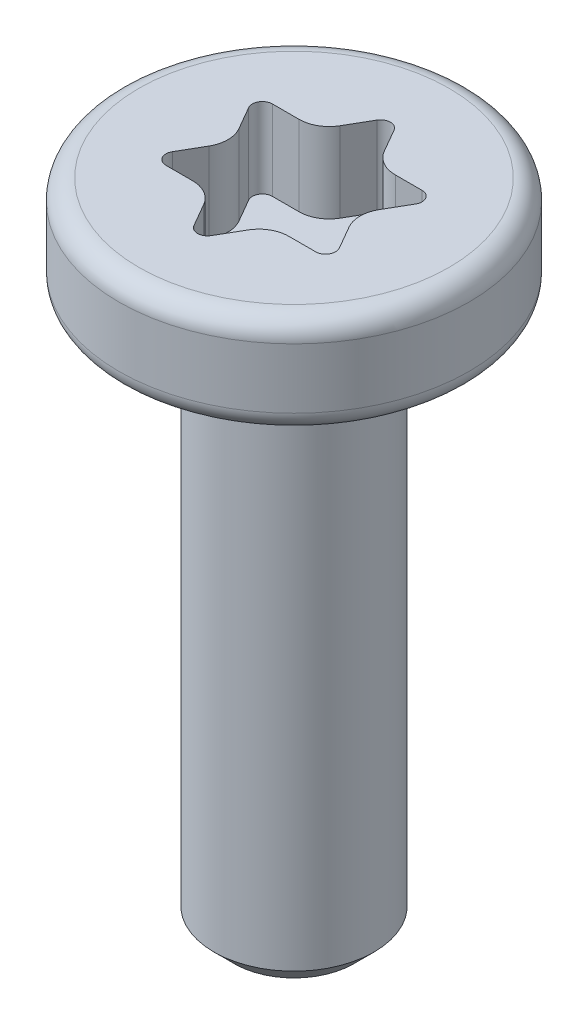
ISO-10303-21;
HEADER;
FILE_DESCRIPTION(('STEP AP214'),'2;1');
FILE_NAME('part.step','',(''),(''),'','','');
FILE_SCHEMA(('AUTOMOTIVE_DESIGN { 1 0 10303 214 1 1 1 1 }'));
ENDSEC;
DATA;
#1=APPLICATION_CONTEXT('core data for automotive mechanical design processes');
#2=APPLICATION_PROTOCOL_DEFINITION('international standard','automotive_design',2000,#1);
#3=PRODUCT_CONTEXT('',#1,'mechanical');
#4=PRODUCT('Part','Part','',(#3));
#5=PRODUCT_RELATED_PRODUCT_CATEGORY('part','',(#4));
#6=PRODUCT_DEFINITION_FORMATION('','',#4);
#7=PRODUCT_DEFINITION_CONTEXT('part definition',#1,'design');
#8=PRODUCT_DEFINITION('design','',#6,#7);
#9=PRODUCT_DEFINITION_SHAPE('','',#8);
#10=(LENGTH_UNIT() NAMED_UNIT(*) SI_UNIT(.MILLI.,.METRE.));
#11=(NAMED_UNIT(*) PLANE_ANGLE_UNIT() SI_UNIT($,.RADIAN.));
#12=(NAMED_UNIT(*) SI_UNIT($,.STERADIAN.) SOLID_ANGLE_UNIT());
#13=UNCERTAINTY_MEASURE_WITH_UNIT(LENGTH_MEASURE(1.E-05),#10,'distance_accuracy_value','');
#14=(GEOMETRIC_REPRESENTATION_CONTEXT(3) GLOBAL_UNCERTAINTY_ASSIGNED_CONTEXT((#13)) GLOBAL_UNIT_ASSIGNED_CONTEXT((#10,
#11,#12)) REPRESENTATION_CONTEXT('',''));
#15=CARTESIAN_POINT('',(0.,0.,0.));
#16=DIRECTION('',(0.,0.,1.));
#17=DIRECTION('',(1.,0.,0.));
#18=AXIS2_PLACEMENT_3D('',#15,#16,#17);
#19=CARTESIAN_POINT('',(0.,0.,0.));
#20=DIRECTION('',(0.,1.,0.));
#21=DIRECTION('',(0.,0.,1.));
#22=AXIS2_PLACEMENT_3D('',#19,#20,#21);
#23=PLANE('',#22);
#24=CARTESIAN_POINT('',(0.,0.,0.));
#25=DIRECTION('',(0.,1.,0.));
#26=DIRECTION('',(0.,0.,1.));
#27=AXIS2_PLACEMENT_3D('',#24,#25,#26);
#28=CIRCLE('',#27,1.55);
#29=CARTESIAN_POINT('',(0.,0.,1.55));
#30=VERTEX_POINT('',#29);
#31=EDGE_CURVE('E362',#30,#30,#28,.F.);
#32=ORIENTED_EDGE('',*,*,#31,.T.);
#33=EDGE_LOOP('',(#32));
#34=FACE_BOUND('',#33,.T.);
#35=CARTESIAN_POINT('',(0.,0.,0.));
#36=DIRECTION('',(0.,1.,0.));
#37=DIRECTION('',(0.,0.,1.));
#38=AXIS2_PLACEMENT_3D('',#35,#36,#37);
#39=CIRCLE('',#38,0.8);
#40=CARTESIAN_POINT('',(0.,0.,0.8));
#41=VERTEX_POINT('',#40);
#42=EDGE_CURVE('E368',#41,#41,#39,.F.);
#43=ORIENTED_EDGE('',*,*,#42,.F.);
#44=EDGE_LOOP('',(#43));
#45=FACE_BOUND('',#44,.T.);
#46=ADVANCED_FACE('F16',(#34,#45),#23,.F.);
#47=CARTESIAN_POINT('',(0.,1.,0.));
#48=DIRECTION('',(0.,-1.,0.));
#49=DIRECTION('',(0.,0.,-1.));
#50=AXIS2_PLACEMENT_3D('',#47,#48,#49);
#51=CYLINDRICAL_SURFACE('',#50,1.75);
#52=CARTESIAN_POINT('',(0.,0.2,0.));
#53=DIRECTION('',(0.,1.,0.));
#54=DIRECTION('',(0.,0.,1.));
#55=AXIS2_PLACEMENT_3D('',#52,#53,#54);
#56=CIRCLE('',#55,1.75);
#57=CARTESIAN_POINT('',(0.,0.2,1.75));
#58=VERTEX_POINT('',#57);
#59=EDGE_CURVE('E359',#58,#58,#56,.T.);
#60=ORIENTED_EDGE('',*,*,#59,.T.);
#61=EDGE_LOOP('',(#60));
#62=FACE_BOUND('',#61,.T.);
#63=CARTESIAN_POINT('',(0.,0.8,0.));
#64=DIRECTION('',(0.,1.,0.));
#65=DIRECTION('',(0.,0.,1.));
#66=AXIS2_PLACEMENT_3D('',#63,#64,#65);
#67=CIRCLE('',#66,1.75);
#68=CARTESIAN_POINT('',(0.,0.8,1.75));
#69=VERTEX_POINT('',#68);
#70=EDGE_CURVE('E356',#69,#69,#67,.F.);
#71=ORIENTED_EDGE('',*,*,#70,.T.);
#72=EDGE_LOOP('',(#71));
#73=FACE_BOUND('',#72,.T.);
#74=ADVANCED_FACE('F393',(#62,#73),#51,.T.);
#75=CARTESIAN_POINT('',(0.,1.,0.));
#76=DIRECTION('',(0.,1.,0.));
#77=DIRECTION('',(0.,0.,1.));
#78=AXIS2_PLACEMENT_3D('',#75,#76,#77);
#79=PLANE('',#78);
#80=DIRECTION('',(-0.5,0.,0.866025403784439));
#81=VECTOR('',#80,1.);
#82=CARTESIAN_POINT('',(0.460493727665039,1.,0.265866177627545));
#83=LINE('',#82,#81);
#84=CARTESIAN_POINT('',(0.834384914951635,1.,-0.38173235525509));
#85=VERTEX_POINT('',#84);
#86=CARTESIAN_POINT('',(0.700594177265163,1.,-0.15));
#87=VERTEX_POINT('',#86);
#88=EDGE_CURVE('E340',#85,#87,#83,.T.);
#89=ORIENTED_EDGE('',*,*,#88,.T.);
#90=CARTESIAN_POINT('',(0.960401798400495,1.,0.));
#91=DIRECTION('',(0.,1.,0.));
#92=DIRECTION('',(0.,0.,1.));
#93=AXIS2_PLACEMENT_3D('',#90,#91,#92);
#94=CIRCLE('',#93,0.3);
#95=CARTESIAN_POINT('',(0.700594177265163,1.,0.15));
#96=VERTEX_POINT('',#95);
#97=EDGE_CURVE('E274',#87,#96,#94,.T.);
#98=ORIENTED_EDGE('',*,*,#97,.T.);
#99=DIRECTION('',(-0.5,0.,-0.866025403784439));
#100=VECTOR('',#99,1.);
#101=CARTESIAN_POINT('',(0.46049372766504,1.,-0.265866177627545));
#102=LINE('',#101,#100);
#103=CARTESIAN_POINT('',(0.834384914951635,1.,0.38173235525509));
#104=VERTEX_POINT('',#103);
#105=EDGE_CURVE('E337',#104,#96,#102,.T.);
#106=ORIENTED_EDGE('',*,*,#105,.F.);
#107=CARTESIAN_POINT('',(0.747782374573191,1.,0.43173235525509));
#108=DIRECTION('',(0.,1.,0.));
#109=DIRECTION('',(0.,0.,1.));
#110=AXIS2_PLACEMENT_3D('',#107,#108,#109);
#111=CIRCLE('',#110,0.1);
#112=CARTESIAN_POINT('',(0.747782374573191,1.,0.53173235525509));
#113=VERTEX_POINT('',#112);
#114=EDGE_CURVE('E252',#104,#113,#111,.F.);
#115=ORIENTED_EDGE('',*,*,#114,.T.);
#116=DIRECTION('',(1.,0.,0.));
#117=VECTOR('',#116,1.);
#118=CARTESIAN_POINT('',(0.,1.,0.53173235525509));
#119=LINE('',#118,#117);
#120=CARTESIAN_POINT('',(0.480200899200247,1.,0.53173235525509));
#121=VERTEX_POINT('',#120);
#122=EDGE_CURVE('E185',#121,#113,#119,.T.);
#123=ORIENTED_EDGE('',*,*,#122,.F.);
#124=CARTESIAN_POINT('',(0.480200899200247,1.,0.831732355255089));
#125=DIRECTION('',(0.,1.,0.));
#126=DIRECTION('',(0.,0.,1.));
#127=AXIS2_PLACEMENT_3D('',#124,#125,#126);
#128=CIRCLE('',#127,0.3);
#129=CARTESIAN_POINT('',(0.220393278064915,1.,0.681732355255089));
#130=VERTEX_POINT('',#129);
#131=EDGE_CURVE('E183',#121,#130,#128,.T.);
#132=ORIENTED_EDGE('',*,*,#131,.T.);
#133=DIRECTION('',(-0.5,0.,0.866025403784439));
#134=VECTOR('',#133,1.);
#135=CARTESIAN_POINT('',(0.460493727665039,1.,0.265866177627545));
#136=LINE('',#135,#134);
#137=CARTESIAN_POINT('',(0.0866025403784438,1.,0.913464710510179));
#138=VERTEX_POINT('',#137);
#139=EDGE_CURVE('E174',#130,#138,#136,.T.);
#140=ORIENTED_EDGE('',*,*,#139,.T.);
#141=CARTESIAN_POINT('',(0.,1.,0.863464710510179));
#142=DIRECTION('',(0.,1.,0.));
#143=DIRECTION('',(0.,0.,1.));
#144=AXIS2_PLACEMENT_3D('',#141,#142,#143);
#145=CIRCLE('',#144,0.1);
#146=CARTESIAN_POINT('',(-0.0866025403784438,1.,0.913464710510179));
#147=VERTEX_POINT('',#146);
#148=EDGE_CURVE('E180',#138,#147,#145,.F.);
#149=ORIENTED_EDGE('',*,*,#148,.T.);
#150=DIRECTION('',(-0.5,0.,-0.866025403784439));
#151=VECTOR('',#150,1.);
#152=CARTESIAN_POINT('',(-0.460493727665039,1.,0.265866177627545));
#153=LINE('',#152,#151);
#154=CARTESIAN_POINT('',(-0.220393278064915,1.,0.681732355255089));
#155=VERTEX_POINT('',#154);
#156=EDGE_CURVE('E186',#147,#155,#153,.T.);
#157=ORIENTED_EDGE('',*,*,#156,.T.);
#158=CARTESIAN_POINT('',(-0.480200899200247,1.,0.831732355255089));
#159=DIRECTION('',(0.,1.,0.));
#160=DIRECTION('',(0.,0.,1.));
#161=AXIS2_PLACEMENT_3D('',#158,#159,#160);
#162=CIRCLE('',#161,0.3);
#163=CARTESIAN_POINT('',(-0.480200899200247,1.,0.53173235525509));
#164=VERTEX_POINT('',#163);
#165=EDGE_CURVE('E266',#155,#164,#162,.T.);
#166=ORIENTED_EDGE('',*,*,#165,.T.);
#167=DIRECTION('',(1.,0.,0.));
#168=VECTOR('',#167,1.);
#169=CARTESIAN_POINT('',(0.,1.,0.53173235525509));
#170=LINE('',#169,#168);
#171=CARTESIAN_POINT('',(-0.747782374573191,1.,0.53173235525509));
#172=VERTEX_POINT('',#171);
#173=EDGE_CURVE('E326',#172,#164,#170,.T.);
#174=ORIENTED_EDGE('',*,*,#173,.F.);
#175=CARTESIAN_POINT('',(-0.747782374573191,1.,0.43173235525509));
#176=DIRECTION('',(0.,1.,0.));
#177=DIRECTION('',(0.,0.,1.));
#178=AXIS2_PLACEMENT_3D('',#175,#176,#177);
#179=CIRCLE('',#178,0.1);
#180=CARTESIAN_POINT('',(-0.834384914951635,1.,0.38173235525509));
#181=VERTEX_POINT('',#180);
#182=EDGE_CURVE('E195',#172,#181,#179,.F.);
#183=ORIENTED_EDGE('',*,*,#182,.T.);
#184=DIRECTION('',(-0.5,0.,0.866025403784439));
#185=VECTOR('',#184,1.);
#186=CARTESIAN_POINT('',(-0.46049372766504,1.,-0.265866177627545));
#187=LINE('',#186,#185);
#188=CARTESIAN_POINT('',(-0.700594177265163,1.,0.15));
#189=VERTEX_POINT('',#188);
#190=EDGE_CURVE('E354',#189,#181,#187,.T.);
#191=ORIENTED_EDGE('',*,*,#190,.F.);
#192=CARTESIAN_POINT('',(-0.960401798400495,1.,0.));
#193=DIRECTION('',(0.,1.,0.));
#194=DIRECTION('',(0.,0.,1.));
#195=AXIS2_PLACEMENT_3D('',#192,#193,#194);
#196=CIRCLE('',#195,0.3);
#197=CARTESIAN_POINT('',(-0.700594177265163,1.,-0.15));
#198=VERTEX_POINT('',#197);
#199=EDGE_CURVE('E268',#189,#198,#196,.T.);
#200=ORIENTED_EDGE('',*,*,#199,.T.);
#201=DIRECTION('',(-0.5,0.,-0.866025403784439));
#202=VECTOR('',#201,1.);
#203=CARTESIAN_POINT('',(-0.460493727665039,1.,0.265866177627545));
#204=LINE('',#203,#202);
#205=CARTESIAN_POINT('',(-0.834384914951635,1.,-0.38173235525509));
#206=VERTEX_POINT('',#205);
#207=EDGE_CURVE('E352',#198,#206,#204,.T.);
#208=ORIENTED_EDGE('',*,*,#207,.T.);
#209=CARTESIAN_POINT('',(-0.747782374573191,1.,-0.43173235525509));
#210=DIRECTION('',(0.,1.,0.));
#211=DIRECTION('',(0.,0.,1.));
#212=AXIS2_PLACEMENT_3D('',#209,#210,#211);
#213=CIRCLE('',#212,0.1);
#214=CARTESIAN_POINT('',(-0.747782374573191,1.,-0.531732355255089));
#215=VERTEX_POINT('',#214);
#216=EDGE_CURVE('E257',#206,#215,#213,.F.);
#217=ORIENTED_EDGE('',*,*,#216,.T.);
#218=DIRECTION('',(1.,0.,0.));
#219=VECTOR('',#218,1.);
#220=CARTESIAN_POINT('',(0.,1.,-0.531732355255089));
#221=LINE('',#220,#219);
#222=CARTESIAN_POINT('',(-0.480200899200248,1.,-0.531732355255089));
#223=VERTEX_POINT('',#222);
#224=EDGE_CURVE('E349',#215,#223,#221,.T.);
#225=ORIENTED_EDGE('',*,*,#224,.T.);
#226=CARTESIAN_POINT('',(-0.480200899200248,1.,-0.831732355255089));
#227=DIRECTION('',(0.,1.,0.));
#228=DIRECTION('',(0.,0.,1.));
#229=AXIS2_PLACEMENT_3D('',#226,#227,#228);
#230=CIRCLE('',#229,0.3);
#231=CARTESIAN_POINT('',(-0.220393278064916,1.,-0.681732355255089));
#232=VERTEX_POINT('',#231);
#233=EDGE_CURVE('E270',#223,#232,#230,.T.);
#234=ORIENTED_EDGE('',*,*,#233,.T.);
#235=DIRECTION('',(-0.5,0.,0.866025403784439));
#236=VECTOR('',#235,1.);
#237=CARTESIAN_POINT('',(-0.46049372766504,1.,-0.265866177627545));
#238=LINE('',#237,#236);
#239=CARTESIAN_POINT('',(-0.086602540378444,1.,-0.913464710510179));
#240=VERTEX_POINT('',#239);
#241=EDGE_CURVE('E346',#240,#232,#238,.T.);
#242=ORIENTED_EDGE('',*,*,#241,.F.);
#243=CARTESIAN_POINT('',(0.,1.,-0.863464710510179));
#244=DIRECTION('',(0.,1.,0.));
#245=DIRECTION('',(0.,0.,1.));
#246=AXIS2_PLACEMENT_3D('',#243,#244,#245);
#247=CIRCLE('',#246,0.1);
#248=CARTESIAN_POINT('',(0.0866025403784437,1.,-0.913464710510179));
#249=VERTEX_POINT('',#248);
#250=EDGE_CURVE('E259',#240,#249,#247,.F.);
#251=ORIENTED_EDGE('',*,*,#250,.T.);
#252=DIRECTION('',(-0.5,0.,-0.866025403784439));
#253=VECTOR('',#252,1.);
#254=CARTESIAN_POINT('',(0.46049372766504,1.,-0.265866177627545));
#255=LINE('',#254,#253);
#256=CARTESIAN_POINT('',(0.220393278064916,1.,-0.681732355255089));
#257=VERTEX_POINT('',#256);
#258=EDGE_CURVE('E344',#257,#249,#255,.T.);
#259=ORIENTED_EDGE('',*,*,#258,.F.);
#260=CARTESIAN_POINT('',(0.480200899200248,1.,-0.831732355255089));
#261=DIRECTION('',(0.,1.,0.));
#262=DIRECTION('',(0.,0.,1.));
#263=AXIS2_PLACEMENT_3D('',#260,#261,#262);
#264=CIRCLE('',#263,0.3);
#265=CARTESIAN_POINT('',(0.480200899200248,1.,-0.531732355255089));
#266=VERTEX_POINT('',#265);
#267=EDGE_CURVE('E272',#257,#266,#264,.T.);
#268=ORIENTED_EDGE('',*,*,#267,.T.);
#269=DIRECTION('',(1.,0.,0.));
#270=VECTOR('',#269,1.);
#271=CARTESIAN_POINT('',(0.,1.,-0.531732355255089));
#272=LINE('',#271,#270);
#273=CARTESIAN_POINT('',(0.747782374573191,1.,-0.531732355255089));
#274=VERTEX_POINT('',#273);
#275=EDGE_CURVE('E342',#266,#274,#272,.T.);
#276=ORIENTED_EDGE('',*,*,#275,.T.);
#277=CARTESIAN_POINT('',(0.747782374573191,1.,-0.43173235525509));
#278=DIRECTION('',(0.,1.,0.));
#279=DIRECTION('',(0.,0.,1.));
#280=AXIS2_PLACEMENT_3D('',#277,#278,#279);
#281=CIRCLE('',#280,0.1);
#282=EDGE_CURVE('E255',#274,#85,#281,.F.);
#283=ORIENTED_EDGE('',*,*,#282,.T.);
#284=EDGE_LOOP('',(#89,#98,#106,#115,#123,#132,#140,#149,#157,#166,#174,#183,#191,#200,#208,
#217,#225,#234,#242,#251,#259,#268,#276,#283));
#285=FACE_BOUND('',#284,.T.);
#286=CARTESIAN_POINT('',(0.,1.,0.));
#287=DIRECTION('',(0.,1.,0.));
#288=DIRECTION('',(0.,0.,1.));
#289=AXIS2_PLACEMENT_3D('',#286,#287,#288);
#290=CIRCLE('',#289,1.55);
#291=CARTESIAN_POINT('',(0.,1.,1.55));
#292=VERTEX_POINT('',#291);
#293=EDGE_CURVE('E365',#292,#292,#290,.T.);
#294=ORIENTED_EDGE('',*,*,#293,.T.);
#295=EDGE_LOOP('',(#294));
#296=FACE_BOUND('',#295,.T.);
#297=ADVANCED_FACE('F177',(#285,#296),#79,.T.);
#298=CARTESIAN_POINT('',(0.,0.2,0.));
#299=DIRECTION('',(0.,1.,0.));
#300=DIRECTION('',(0.,0.,1.));
#301=AXIS2_PLACEMENT_3D('',#298,#299,#300);
#302=TOROIDAL_SURFACE('',#301,1.55,0.2);
#303=ORIENTED_EDGE('',*,*,#31,.F.);
#304=EDGE_LOOP('',(#303));
#305=FACE_BOUND('',#304,.T.);
#306=ORIENTED_EDGE('',*,*,#59,.F.);
#307=EDGE_LOOP('',(#306));
#308=FACE_BOUND('',#307,.T.);
#309=ADVANCED_FACE('F406',(#305,#308),#302,.T.);
#310=CARTESIAN_POINT('',(0.,0.8,0.));
#311=DIRECTION('',(0.,1.,0.));
#312=DIRECTION('',(0.,0.,1.));
#313=AXIS2_PLACEMENT_3D('',#310,#311,#312);
#314=TOROIDAL_SURFACE('',#313,1.55,0.2);
#315=ORIENTED_EDGE('',*,*,#70,.F.);
#316=EDGE_LOOP('',(#315));
#317=FACE_BOUND('',#316,.T.);
#318=ORIENTED_EDGE('',*,*,#293,.F.);
#319=EDGE_LOOP('',(#318));
#320=FACE_BOUND('',#319,.T.);
#321=ADVANCED_FACE('F408',(#317,#320),#314,.T.);
#322=CARTESIAN_POINT('',(0.,-5.5,0.));
#323=DIRECTION('',(0.,1.,0.));
#324=DIRECTION('',(0.,0.,1.));
#325=AXIS2_PLACEMENT_3D('',#322,#323,#324);
#326=CYLINDRICAL_SURFACE('',#325,0.8);
#327=CARTESIAN_POINT('',(0.,-5.3,0.));
#328=DIRECTION('',(0.,-1.,0.));
#329=DIRECTION('',(0.,0.,-1.));
#330=AXIS2_PLACEMENT_3D('',#327,#328,#329);
#331=CIRCLE('',#330,0.8);
#332=CARTESIAN_POINT('',(0.,-5.3,-0.8));
#333=VERTEX_POINT('',#332);
#334=EDGE_CURVE('E201',#333,#333,#331,.F.);
#335=ORIENTED_EDGE('',*,*,#334,.T.);
#336=EDGE_LOOP('',(#335));
#337=FACE_BOUND('',#336,.T.);
#338=ORIENTED_EDGE('',*,*,#42,.T.);
#339=EDGE_LOOP('',(#338));
#340=FACE_BOUND('',#339,.T.);
#341=ADVANCED_FACE('F387',(#337,#340),#326,.T.);
#342=CARTESIAN_POINT('',(0.,-5.5,0.));
#343=DIRECTION('',(0.,-1.,0.));
#344=DIRECTION('',(0.,0.,-1.));
#345=AXIS2_PLACEMENT_3D('',#342,#343,#344);
#346=PLANE('',#345);
#347=CARTESIAN_POINT('',(0.,-5.5,0.));
#348=DIRECTION('',(0.,-1.,0.));
#349=DIRECTION('',(0.,0.,-1.));
#350=AXIS2_PLACEMENT_3D('',#347,#348,#349);
#351=CIRCLE('',#350,0.6);
#352=CARTESIAN_POINT('',(0.,-5.5,-0.6));
#353=VERTEX_POINT('',#352);
#354=EDGE_CURVE('E206',#353,#353,#351,.T.);
#355=ORIENTED_EDGE('',*,*,#354,.T.);
#356=EDGE_LOOP('',(#355));
#357=FACE_BOUND('',#356,.T.);
#358=ADVANCED_FACE('F373',(#357),#346,.T.);
#359=CARTESIAN_POINT('',(0.,-5.5,0.));
#360=DIRECTION('',(0.,1.,0.));
#361=DIRECTION('',(0.,0.,1.));
#362=AXIS2_PLACEMENT_3D('',#359,#360,#361);
#363=CONICAL_SURFACE('',#362,0.6,0.785398163397445);
#364=ORIENTED_EDGE('',*,*,#334,.F.);
#365=EDGE_LOOP('',(#364));
#366=FACE_BOUND('',#365,.T.);
#367=ORIENTED_EDGE('',*,*,#354,.F.);
#368=EDGE_LOOP('',(#367));
#369=FACE_BOUND('',#368,.T.);
#370=ADVANCED_FACE('F375',(#366,#369),#363,.T.);
#371=CARTESIAN_POINT('',(0.,0.2,0.53173235525509));
#372=DIRECTION('',(0.,0.,1.));
#373=DIRECTION('',(1.,0.,0.));
#374=AXIS2_PLACEMENT_3D('',#371,#372,#373);
#375=PLANE('',#374);
#376=ORIENTED_EDGE('',*,*,#173,.T.);
#377=DIRECTION('',(0.,1.,0.));
#378=VECTOR('',#377,1.);
#379=CARTESIAN_POINT('',(-0.480200899200247,0.2,0.53173235525509));
#380=LINE('',#379,#378);
#381=CARTESIAN_POINT('',(-0.480200899200247,0.2,0.53173235525509));
#382=VERTEX_POINT('',#381);
#383=EDGE_CURVE('E296',#164,#382,#380,.F.);
#384=ORIENTED_EDGE('',*,*,#383,.T.);
#385=DIRECTION('',(1.,0.,0.));
#386=VECTOR('',#385,1.);
#387=CARTESIAN_POINT('',(0.,0.2,0.53173235525509));
#388=LINE('',#387,#386);
#389=CARTESIAN_POINT('',(-0.747782374573191,0.2,0.53173235525509));
#390=VERTEX_POINT('',#389);
#391=EDGE_CURVE('E316',#390,#382,#388,.T.);
#392=ORIENTED_EDGE('',*,*,#391,.F.);
#393=DIRECTION('',(0.,1.,0.));
#394=VECTOR('',#393,1.);
#395=CARTESIAN_POINT('',(-0.747782374573191,1.,0.53173235525509));
#396=LINE('',#395,#394);
#397=EDGE_CURVE('E223',#390,#172,#396,.T.);
#398=ORIENTED_EDGE('',*,*,#397,.T.);
#399=EDGE_LOOP('',(#376,#384,#392,#398));
#400=FACE_BOUND('',#399,.T.);
#401=ADVANCED_FACE('F328',(#400),#375,.F.);
#402=CARTESIAN_POINT('',(-0.46049372766504,0.2,-0.265866177627545));
#403=DIRECTION('',(-0.866025403784439,0.,-0.5));
#404=DIRECTION('',(-0.5,0.,0.866025403784439));
#405=AXIS2_PLACEMENT_3D('',#402,#403,#404);
#406=PLANE('',#405);
#407=DIRECTION('',(-0.5,0.,0.866025403784439));
#408=VECTOR('',#407,1.);
#409=CARTESIAN_POINT('',(-0.46049372766504,0.2,-0.265866177627545));
#410=LINE('',#409,#408);
#411=CARTESIAN_POINT('',(-0.700594177265163,0.2,0.15));
#412=VERTEX_POINT('',#411);
#413=CARTESIAN_POINT('',(-0.834384914951635,0.2,0.38173235525509));
#414=VERTEX_POINT('',#413);
#415=EDGE_CURVE('E333',#412,#414,#410,.T.);
#416=ORIENTED_EDGE('',*,*,#415,.F.);
#417=DIRECTION('',(0.,1.,0.));
#418=VECTOR('',#417,1.);
#419=CARTESIAN_POINT('',(-0.700594177265163,1.,0.15));
#420=LINE('',#419,#418);
#421=EDGE_CURVE('E288',#412,#189,#420,.T.);
#422=ORIENTED_EDGE('',*,*,#421,.T.);
#423=ORIENTED_EDGE('',*,*,#190,.T.);
#424=DIRECTION('',(0.,1.,0.));
#425=VECTOR('',#424,1.);
#426=CARTESIAN_POINT('',(-0.834384914951635,0.2,0.38173235525509));
#427=LINE('',#426,#425);
#428=EDGE_CURVE('E226',#181,#414,#427,.F.);
#429=ORIENTED_EDGE('',*,*,#428,.T.);
#430=EDGE_LOOP('',(#416,#422,#423,#429));
#431=FACE_BOUND('',#430,.T.);
#432=ADVANCED_FACE('F385',(#431),#406,.F.);
#433=CARTESIAN_POINT('',(-0.460493727665039,0.2,0.265866177627545));
#434=DIRECTION('',(0.866025403784439,0.,-0.5));
#435=DIRECTION('',(-0.5,0.,-0.866025403784439));
#436=AXIS2_PLACEMENT_3D('',#433,#434,#435);
#437=PLANE('',#436);
#438=ORIENTED_EDGE('',*,*,#207,.F.);
#439=DIRECTION('',(0.,1.,0.));
#440=VECTOR('',#439,1.);
#441=CARTESIAN_POINT('',(-0.700594177265163,0.2,-0.15));
#442=LINE('',#441,#440);
#443=CARTESIAN_POINT('',(-0.700594177265163,0.2,-0.15));
#444=VERTEX_POINT('',#443);
#445=EDGE_CURVE('E291',#198,#444,#442,.F.);
#446=ORIENTED_EDGE('',*,*,#445,.T.);
#447=DIRECTION('',(-0.5,0.,-0.866025403784439));
#448=VECTOR('',#447,1.);
#449=CARTESIAN_POINT('',(-0.460493727665039,0.2,0.265866177627545));
#450=LINE('',#449,#448);
#451=CARTESIAN_POINT('',(-0.834384914951635,0.2,-0.38173235525509));
#452=VERTEX_POINT('',#451);
#453=EDGE_CURVE('E720',#444,#452,#450,.T.);
#454=ORIENTED_EDGE('',*,*,#453,.T.);
#455=DIRECTION('',(0.,1.,0.));
#456=VECTOR('',#455,1.);
#457=CARTESIAN_POINT('',(-0.834384914951635,1.,-0.38173235525509));
#458=LINE('',#457,#456);
#459=EDGE_CURVE('E240',#452,#206,#458,.T.);
#460=ORIENTED_EDGE('',*,*,#459,.T.);
#461=EDGE_LOOP('',(#438,#446,#454,#460));
#462=FACE_BOUND('',#461,.T.);
#463=ADVANCED_FACE('F471',(#462),#437,.T.);
#464=CARTESIAN_POINT('',(0.,0.2,-0.531732355255089));
#465=DIRECTION('',(0.,0.,1.));
#466=DIRECTION('',(1.,0.,0.));
#467=AXIS2_PLACEMENT_3D('',#464,#465,#466);
#468=PLANE('',#467);
#469=DIRECTION('',(1.,0.,0.));
#470=VECTOR('',#469,1.);
#471=CARTESIAN_POINT('',(0.,0.2,-0.531732355255089));
#472=LINE('',#471,#470);
#473=CARTESIAN_POINT('',(-0.747782374573191,0.2,-0.531732355255089));
#474=VERTEX_POINT('',#473);
#475=CARTESIAN_POINT('',(-0.480200899200248,0.2,-0.531732355255089));
#476=VERTEX_POINT('',#475);
#477=EDGE_CURVE('E718',#474,#476,#472,.T.);
#478=ORIENTED_EDGE('',*,*,#477,.T.);
#479=DIRECTION('',(0.,1.,0.));
#480=VECTOR('',#479,1.);
#481=CARTESIAN_POINT('',(-0.480200899200248,1.,-0.531732355255089));
#482=LINE('',#481,#480);
#483=EDGE_CURVE('E283',#476,#223,#482,.T.);
#484=ORIENTED_EDGE('',*,*,#483,.T.);
#485=ORIENTED_EDGE('',*,*,#224,.F.);
#486=DIRECTION('',(0.,1.,0.));
#487=VECTOR('',#486,1.);
#488=CARTESIAN_POINT('',(-0.747782374573191,0.2,-0.531732355255089));
#489=LINE('',#488,#487);
#490=EDGE_CURVE('E243',#215,#474,#489,.F.);
#491=ORIENTED_EDGE('',*,*,#490,.T.);
#492=EDGE_LOOP('',(#478,#484,#485,#491));
#493=FACE_BOUND('',#492,.T.);
#494=ADVANCED_FACE('F481',(#493),#468,.T.);
#495=CARTESIAN_POINT('',(-0.46049372766504,0.2,-0.265866177627545));
#496=DIRECTION('',(-0.866025403784439,0.,-0.5));
#497=DIRECTION('',(-0.5,0.,0.866025403784439));
#498=AXIS2_PLACEMENT_3D('',#495,#496,#497);
#499=PLANE('',#498);
#500=ORIENTED_EDGE('',*,*,#241,.T.);
#501=DIRECTION('',(0.,1.,0.));
#502=VECTOR('',#501,1.);
#503=CARTESIAN_POINT('',(-0.220393278064916,0.2,-0.681732355255089));
#504=LINE('',#503,#502);
#505=CARTESIAN_POINT('',(-0.220393278064916,0.2,-0.681732355255089));
#506=VERTEX_POINT('',#505);
#507=EDGE_CURVE('E286',#232,#506,#504,.F.);
#508=ORIENTED_EDGE('',*,*,#507,.T.);
#509=DIRECTION('',(-0.5,0.,0.866025403784439));
#510=VECTOR('',#509,1.);
#511=CARTESIAN_POINT('',(-0.46049372766504,0.2,-0.265866177627545));
#512=LINE('',#511,#510);
#513=CARTESIAN_POINT('',(-0.086602540378444,0.2,-0.913464710510179));
#514=VERTEX_POINT('',#513);
#515=EDGE_CURVE('E715',#514,#506,#512,.T.);
#516=ORIENTED_EDGE('',*,*,#515,.F.);
#517=DIRECTION('',(0.,1.,0.));
#518=VECTOR('',#517,1.);
#519=CARTESIAN_POINT('',(-0.0866025403784439,1.,-0.913464710510179));
#520=LINE('',#519,#518);
#521=EDGE_CURVE('E245',#514,#240,#520,.T.);
#522=ORIENTED_EDGE('',*,*,#521,.T.);
#523=EDGE_LOOP('',(#500,#508,#516,#522));
#524=FACE_BOUND('',#523,.T.);
#525=ADVANCED_FACE('F491',(#524),#499,.F.);
#526=CARTESIAN_POINT('',(0.46049372766504,0.2,-0.265866177627545));
#527=DIRECTION('',(0.866025403784439,0.,-0.5));
#528=DIRECTION('',(-0.5,0.,-0.866025403784439));
#529=AXIS2_PLACEMENT_3D('',#526,#527,#528);
#530=PLANE('',#529);
#531=DIRECTION('',(-0.5,0.,-0.866025403784439));
#532=VECTOR('',#531,1.);
#533=CARTESIAN_POINT('',(0.46049372766504,0.2,-0.265866177627545));
#534=LINE('',#533,#532);
#535=CARTESIAN_POINT('',(0.220393278064916,0.2,-0.681732355255089));
#536=VERTEX_POINT('',#535);
#537=CARTESIAN_POINT('',(0.0866025403784437,0.2,-0.913464710510179));
#538=VERTEX_POINT('',#537);
#539=EDGE_CURVE('E713',#536,#538,#534,.T.);
#540=ORIENTED_EDGE('',*,*,#539,.F.);
#541=DIRECTION('',(0.,1.,0.));
#542=VECTOR('',#541,1.);
#543=CARTESIAN_POINT('',(0.220393278064916,1.,-0.681732355255089));
#544=LINE('',#543,#542);
#545=EDGE_CURVE('E278',#536,#257,#544,.T.);
#546=ORIENTED_EDGE('',*,*,#545,.T.);
#547=ORIENTED_EDGE('',*,*,#258,.T.);
#548=DIRECTION('',(0.,1.,0.));
#549=VECTOR('',#548,1.);
#550=CARTESIAN_POINT('',(0.0866025403784439,0.2,-0.913464710510179));
#551=LINE('',#550,#549);
#552=EDGE_CURVE('E196',#249,#538,#551,.F.);
#553=ORIENTED_EDGE('',*,*,#552,.T.);
#554=EDGE_LOOP('',(#540,#546,#547,#553));
#555=FACE_BOUND('',#554,.T.);
#556=ADVANCED_FACE('F501',(#555),#530,.F.);
#557=CARTESIAN_POINT('',(0.,0.2,-0.531732355255089));
#558=DIRECTION('',(0.,0.,1.));
#559=DIRECTION('',(1.,0.,0.));
#560=AXIS2_PLACEMENT_3D('',#557,#558,#559);
#561=PLANE('',#560);
#562=ORIENTED_EDGE('',*,*,#275,.F.);
#563=DIRECTION('',(0.,1.,0.));
#564=VECTOR('',#563,1.);
#565=CARTESIAN_POINT('',(0.480200899200248,0.2,-0.531732355255089));
#566=LINE('',#565,#564);
#567=CARTESIAN_POINT('',(0.480200899200248,0.2,-0.531732355255089));
#568=VERTEX_POINT('',#567);
#569=EDGE_CURVE('E281',#266,#568,#566,.F.);
#570=ORIENTED_EDGE('',*,*,#569,.T.);
#571=DIRECTION('',(1.,0.,0.));
#572=VECTOR('',#571,1.);
#573=CARTESIAN_POINT('',(0.,0.2,-0.531732355255089));
#574=LINE('',#573,#572);
#575=CARTESIAN_POINT('',(0.747782374573191,0.2,-0.531732355255089));
#576=VERTEX_POINT('',#575);
#577=EDGE_CURVE('E707',#568,#576,#574,.T.);
#578=ORIENTED_EDGE('',*,*,#577,.T.);
#579=DIRECTION('',(0.,1.,0.));
#580=VECTOR('',#579,1.);
#581=CARTESIAN_POINT('',(0.747782374573191,1.,-0.531732355255089));
#582=LINE('',#581,#580);
#583=EDGE_CURVE('E235',#576,#274,#582,.T.);
#584=ORIENTED_EDGE('',*,*,#583,.T.);
#585=EDGE_LOOP('',(#562,#570,#578,#584));
#586=FACE_BOUND('',#585,.T.);
#587=ADVANCED_FACE('F511',(#586),#561,.T.);
#588=CARTESIAN_POINT('',(0.460493727665039,0.2,0.265866177627545));
#589=DIRECTION('',(-0.866025403784439,0.,-0.5));
#590=DIRECTION('',(-0.5,0.,0.866025403784439));
#591=AXIS2_PLACEMENT_3D('',#588,#589,#590);
#592=PLANE('',#591);
#593=DIRECTION('',(-0.5,0.,0.866025403784439));
#594=VECTOR('',#593,1.);
#595=CARTESIAN_POINT('',(0.460493727665039,0.2,0.265866177627545));
#596=LINE('',#595,#594);
#597=CARTESIAN_POINT('',(0.834384914951635,0.2,-0.38173235525509));
#598=VERTEX_POINT('',#597);
#599=CARTESIAN_POINT('',(0.700594177265163,0.2,-0.15));
#600=VERTEX_POINT('',#599);
#601=EDGE_CURVE('E704',#598,#600,#596,.T.);
#602=ORIENTED_EDGE('',*,*,#601,.T.);
#603=DIRECTION('',(0.,1.,0.));
#604=VECTOR('',#603,1.);
#605=CARTESIAN_POINT('',(0.700594177265163,1.,-0.15));
#606=LINE('',#605,#604);
#607=EDGE_CURVE('E262',#600,#87,#606,.T.);
#608=ORIENTED_EDGE('',*,*,#607,.T.);
#609=ORIENTED_EDGE('',*,*,#88,.F.);
#610=DIRECTION('',(0.,1.,0.));
#611=VECTOR('',#610,1.);
#612=CARTESIAN_POINT('',(0.834384914951635,0.2,-0.38173235525509));
#613=LINE('',#612,#611);
#614=EDGE_CURVE('E238',#85,#598,#613,.F.);
#615=ORIENTED_EDGE('',*,*,#614,.T.);
#616=EDGE_LOOP('',(#602,#608,#609,#615));
#617=FACE_BOUND('',#616,.T.);
#618=ADVANCED_FACE('F521',(#617),#592,.T.);
#619=CARTESIAN_POINT('',(0.46049372766504,0.2,-0.265866177627545));
#620=DIRECTION('',(0.866025403784439,0.,-0.5));
#621=DIRECTION('',(-0.5,0.,-0.866025403784439));
#622=AXIS2_PLACEMENT_3D('',#619,#620,#621);
#623=PLANE('',#622);
#624=ORIENTED_EDGE('',*,*,#105,.T.);
#625=DIRECTION('',(0.,1.,0.));
#626=VECTOR('',#625,1.);
#627=CARTESIAN_POINT('',(0.700594177265163,0.2,0.15));
#628=LINE('',#627,#626);
#629=CARTESIAN_POINT('',(0.700594177265163,0.2,0.15));
#630=VERTEX_POINT('',#629);
#631=EDGE_CURVE('E276',#96,#630,#628,.F.);
#632=ORIENTED_EDGE('',*,*,#631,.T.);
#633=DIRECTION('',(-0.5,0.,-0.866025403784439));
#634=VECTOR('',#633,1.);
#635=CARTESIAN_POINT('',(0.46049372766504,0.2,-0.265866177627545));
#636=LINE('',#635,#634);
#637=CARTESIAN_POINT('',(0.834384914951635,0.2,0.38173235525509));
#638=VERTEX_POINT('',#637);
#639=EDGE_CURVE('E701',#638,#630,#636,.T.);
#640=ORIENTED_EDGE('',*,*,#639,.F.);
#641=DIRECTION('',(0.,1.,0.));
#642=VECTOR('',#641,1.);
#643=CARTESIAN_POINT('',(0.834384914951635,1.,0.38173235525509));
#644=LINE('',#643,#642);
#645=EDGE_CURVE('E229',#638,#104,#644,.T.);
#646=ORIENTED_EDGE('',*,*,#645,.T.);
#647=EDGE_LOOP('',(#624,#632,#640,#646));
#648=FACE_BOUND('',#647,.T.);
#649=ADVANCED_FACE('F531',(#648),#623,.F.);
#650=CARTESIAN_POINT('',(0.,0.2,0.53173235525509));
#651=DIRECTION('',(0.,0.,1.));
#652=DIRECTION('',(1.,0.,0.));
#653=AXIS2_PLACEMENT_3D('',#650,#651,#652);
#654=PLANE('',#653);
#655=DIRECTION('',(1.,0.,0.));
#656=VECTOR('',#655,1.);
#657=CARTESIAN_POINT('',(0.,0.2,0.53173235525509));
#658=LINE('',#657,#656);
#659=CARTESIAN_POINT('',(0.480200899200247,0.2,0.53173235525509));
#660=VERTEX_POINT('',#659);
#661=CARTESIAN_POINT('',(0.747782374573191,0.2,0.53173235525509));
#662=VERTEX_POINT('',#661);
#663=EDGE_CURVE('E694',#660,#662,#658,.T.);
#664=ORIENTED_EDGE('',*,*,#663,.F.);
#665=DIRECTION('',(0.,1.,0.));
#666=VECTOR('',#665,1.);
#667=CARTESIAN_POINT('',(0.480200899200247,1.,0.53173235525509));
#668=LINE('',#667,#666);
#669=EDGE_CURVE('E298',#660,#121,#668,.T.);
#670=ORIENTED_EDGE('',*,*,#669,.T.);
#671=ORIENTED_EDGE('',*,*,#122,.T.);
#672=DIRECTION('',(0.,1.,0.));
#673=VECTOR('',#672,1.);
#674=CARTESIAN_POINT('',(0.747782374573191,0.2,0.53173235525509));
#675=LINE('',#674,#673);
#676=EDGE_CURVE('E232',#113,#662,#675,.F.);
#677=ORIENTED_EDGE('',*,*,#676,.T.);
#678=EDGE_LOOP('',(#664,#670,#671,#677));
#679=FACE_BOUND('',#678,.T.);
#680=ADVANCED_FACE('F541',(#679),#654,.F.);
#681=CARTESIAN_POINT('',(0.460493727665039,0.2,0.265866177627545));
#682=DIRECTION('',(-0.866025403784439,0.,-0.5));
#683=DIRECTION('',(-0.5,0.,0.866025403784439));
#684=AXIS2_PLACEMENT_3D('',#681,#682,#683);
#685=PLANE('',#684);
#686=ORIENTED_EDGE('',*,*,#139,.F.);
#687=DIRECTION('',(0.,1.,0.));
#688=VECTOR('',#687,1.);
#689=CARTESIAN_POINT('',(0.220393278064915,0.2,0.681732355255089));
#690=LINE('',#689,#688);
#691=CARTESIAN_POINT('',(0.220393278064915,0.2,0.681732355255089));
#692=VERTEX_POINT('',#691);
#693=EDGE_CURVE('E31',#130,#692,#690,.F.);
#694=ORIENTED_EDGE('',*,*,#693,.T.);
#695=DIRECTION('',(-0.5,0.,0.866025403784439));
#696=VECTOR('',#695,1.);
#697=CARTESIAN_POINT('',(0.460493727665039,0.2,0.265866177627545));
#698=LINE('',#697,#696);
#699=CARTESIAN_POINT('',(0.0866025403784438,0.2,0.913464710510179));
#700=VERTEX_POINT('',#699);
#701=EDGE_CURVE('E199',#692,#700,#698,.T.);
#702=ORIENTED_EDGE('',*,*,#701,.T.);
#703=DIRECTION('',(0.,1.,0.));
#704=VECTOR('',#703,1.);
#705=CARTESIAN_POINT('',(0.0866025403784439,1.,0.913464710510179));
#706=LINE('',#705,#704);
#707=EDGE_CURVE('E193',#700,#138,#706,.T.);
#708=ORIENTED_EDGE('',*,*,#707,.T.);
#709=EDGE_LOOP('',(#686,#694,#702,#708));
#710=FACE_BOUND('',#709,.T.);
#711=ADVANCED_FACE('F198',(#710),#685,.T.);
#712=CARTESIAN_POINT('',(-0.460493727665039,0.2,0.265866177627545));
#713=DIRECTION('',(0.866025403784439,0.,-0.5));
#714=DIRECTION('',(-0.5,0.,-0.866025403784439));
#715=AXIS2_PLACEMENT_3D('',#712,#713,#714);
#716=PLANE('',#715);
#717=DIRECTION('',(-0.5,0.,-0.866025403784439));
#718=VECTOR('',#717,1.);
#719=CARTESIAN_POINT('',(-0.460493727665039,0.2,0.265866177627545));
#720=LINE('',#719,#718);
#721=CARTESIAN_POINT('',(-0.0866025403784438,0.2,0.913464710510179));
#722=VERTEX_POINT('',#721);
#723=CARTESIAN_POINT('',(-0.220393278064915,0.2,0.681732355255089));
#724=VERTEX_POINT('',#723);
#725=EDGE_CURVE('E314',#722,#724,#720,.T.);
#726=ORIENTED_EDGE('',*,*,#725,.T.);
#727=DIRECTION('',(0.,1.,0.));
#728=VECTOR('',#727,1.);
#729=CARTESIAN_POINT('',(-0.220393278064915,1.,0.681732355255089));
#730=LINE('',#729,#728);
#731=EDGE_CURVE('E293',#724,#155,#730,.T.);
#732=ORIENTED_EDGE('',*,*,#731,.T.);
#733=ORIENTED_EDGE('',*,*,#156,.F.);
#734=DIRECTION('',(0.,1.,0.));
#735=VECTOR('',#734,1.);
#736=CARTESIAN_POINT('',(-0.0866025403784439,0.2,0.913464710510179));
#737=LINE('',#736,#735);
#738=EDGE_CURVE('E194',#147,#722,#737,.F.);
#739=ORIENTED_EDGE('',*,*,#738,.T.);
#740=EDGE_LOOP('',(#726,#732,#733,#739));
#741=FACE_BOUND('',#740,.T.);
#742=ADVANCED_FACE('F321',(#741),#716,.T.);
#743=CARTESIAN_POINT('',(0.,0.2,0.));
#744=DIRECTION('',(0.,1.,0.));
#745=DIRECTION('',(0.,0.,1.));
#746=AXIS2_PLACEMENT_3D('',#743,#744,#745);
#747=PLANE('',#746);
#748=ORIENTED_EDGE('',*,*,#725,.F.);
#749=CARTESIAN_POINT('',(0.,0.2,0.863464710510179));
#750=DIRECTION('',(0.,1.,0.));
#751=DIRECTION('',(0.,0.,1.));
#752=AXIS2_PLACEMENT_3D('',#749,#750,#751);
#753=CIRCLE('',#752,0.1);
#754=EDGE_CURVE('E221',#722,#700,#753,.T.);
#755=ORIENTED_EDGE('',*,*,#754,.T.);
#756=ORIENTED_EDGE('',*,*,#701,.F.);
#757=CARTESIAN_POINT('',(0.480200899200247,0.2,0.831732355255089));
#758=DIRECTION('',(0.,1.,0.));
#759=DIRECTION('',(0.,0.,1.));
#760=AXIS2_PLACEMENT_3D('',#757,#758,#759);
#761=CIRCLE('',#760,0.3);
#762=EDGE_CURVE('E11',#692,#660,#761,.F.);
#763=ORIENTED_EDGE('',*,*,#762,.T.);
#764=ORIENTED_EDGE('',*,*,#663,.T.);
#765=CARTESIAN_POINT('',(0.747782374573191,0.2,0.43173235525509));
#766=DIRECTION('',(0.,1.,0.));
#767=DIRECTION('',(0.,0.,1.));
#768=AXIS2_PLACEMENT_3D('',#765,#766,#767);
#769=CIRCLE('',#768,0.1);
#770=EDGE_CURVE('E217',#662,#638,#769,.T.);
#771=ORIENTED_EDGE('',*,*,#770,.T.);
#772=ORIENTED_EDGE('',*,*,#639,.T.);
#773=CARTESIAN_POINT('',(0.960401798400495,0.2,0.));
#774=DIRECTION('',(0.,1.,0.));
#775=DIRECTION('',(0.,0.,1.));
#776=AXIS2_PLACEMENT_3D('',#773,#774,#775);
#777=CIRCLE('',#776,0.3);
#778=EDGE_CURVE('E302',#630,#600,#777,.F.);
#779=ORIENTED_EDGE('',*,*,#778,.T.);
#780=ORIENTED_EDGE('',*,*,#601,.F.);
#781=CARTESIAN_POINT('',(0.747782374573191,0.2,-0.43173235525509));
#782=DIRECTION('',(0.,1.,0.));
#783=DIRECTION('',(0.,0.,1.));
#784=AXIS2_PLACEMENT_3D('',#781,#782,#783);
#785=CIRCLE('',#784,0.1);
#786=EDGE_CURVE('E214',#598,#576,#785,.T.);
#787=ORIENTED_EDGE('',*,*,#786,.T.);
#788=ORIENTED_EDGE('',*,*,#577,.F.);
#789=CARTESIAN_POINT('',(0.480200899200248,0.2,-0.831732355255089));
#790=DIRECTION('',(0.,1.,0.));
#791=DIRECTION('',(0.,0.,1.));
#792=AXIS2_PLACEMENT_3D('',#789,#790,#791);
#793=CIRCLE('',#792,0.3);
#794=EDGE_CURVE('E304',#568,#536,#793,.F.);
#795=ORIENTED_EDGE('',*,*,#794,.T.);
#796=ORIENTED_EDGE('',*,*,#539,.T.);
#797=CARTESIAN_POINT('',(0.,0.2,-0.863464710510179));
#798=DIRECTION('',(0.,1.,0.));
#799=DIRECTION('',(0.,0.,1.));
#800=AXIS2_PLACEMENT_3D('',#797,#798,#799);
#801=CIRCLE('',#800,0.1);
#802=EDGE_CURVE('E203',#538,#514,#801,.T.);
#803=ORIENTED_EDGE('',*,*,#802,.T.);
#804=ORIENTED_EDGE('',*,*,#515,.T.);
#805=CARTESIAN_POINT('',(-0.480200899200248,0.2,-0.831732355255089));
#806=DIRECTION('',(0.,1.,0.));
#807=DIRECTION('',(0.,0.,1.));
#808=AXIS2_PLACEMENT_3D('',#805,#806,#807);
#809=CIRCLE('',#808,0.3);
#810=EDGE_CURVE('E306',#506,#476,#809,.F.);
#811=ORIENTED_EDGE('',*,*,#810,.T.);
#812=ORIENTED_EDGE('',*,*,#477,.F.);
#813=CARTESIAN_POINT('',(-0.747782374573191,0.2,-0.43173235525509));
#814=DIRECTION('',(0.,1.,0.));
#815=DIRECTION('',(0.,0.,1.));
#816=AXIS2_PLACEMENT_3D('',#813,#814,#815);
#817=CIRCLE('',#816,0.1);
#818=EDGE_CURVE('E211',#474,#452,#817,.T.);
#819=ORIENTED_EDGE('',*,*,#818,.T.);
#820=ORIENTED_EDGE('',*,*,#453,.F.);
#821=CARTESIAN_POINT('',(-0.960401798400495,0.2,0.));
#822=DIRECTION('',(0.,1.,0.));
#823=DIRECTION('',(0.,0.,1.));
#824=AXIS2_PLACEMENT_3D('',#821,#822,#823);
#825=CIRCLE('',#824,0.3);
#826=EDGE_CURVE('E308',#444,#412,#825,.F.);
#827=ORIENTED_EDGE('',*,*,#826,.T.);
#828=ORIENTED_EDGE('',*,*,#415,.T.);
#829=CARTESIAN_POINT('',(-0.747782374573191,0.2,0.43173235525509));
#830=DIRECTION('',(0.,1.,0.));
#831=DIRECTION('',(0.,0.,1.));
#832=AXIS2_PLACEMENT_3D('',#829,#830,#831);
#833=CIRCLE('',#832,0.1);
#834=EDGE_CURVE('E219',#414,#390,#833,.T.);
#835=ORIENTED_EDGE('',*,*,#834,.T.);
#836=ORIENTED_EDGE('',*,*,#391,.T.);
#837=CARTESIAN_POINT('',(-0.480200899200247,0.2,0.831732355255089));
#838=DIRECTION('',(0.,1.,0.));
#839=DIRECTION('',(0.,0.,1.));
#840=AXIS2_PLACEMENT_3D('',#837,#838,#839);
#841=CIRCLE('',#840,0.3);
#842=EDGE_CURVE('E24',#382,#724,#841,.F.);
#843=ORIENTED_EDGE('',*,*,#842,.T.);
#844=EDGE_LOOP('',(#748,#755,#756,#763,#764,#771,#772,#779,#780,#787,#788,#795,#796,#803,#804,
#811,#812,#819,#820,#827,#828,#835,#836,#843));
#845=FACE_BOUND('',#844,.T.);
#846=ADVANCED_FACE('F313',(#845),#747,.T.);
#847=CARTESIAN_POINT('',(0.,0.2,0.863464710510179));
#848=DIRECTION('',(0.,-1.,0.));
#849=DIRECTION('',(0.,0.,-1.));
#850=AXIS2_PLACEMENT_3D('',#847,#848,#849);
#851=CYLINDRICAL_SURFACE('',#850,0.1);
#852=ORIENTED_EDGE('',*,*,#754,.F.);
#853=ORIENTED_EDGE('',*,*,#738,.F.);
#854=ORIENTED_EDGE('',*,*,#148,.F.);
#855=ORIENTED_EDGE('',*,*,#707,.F.);
#856=EDGE_LOOP('',(#852,#853,#854,#855));
#857=FACE_BOUND('',#856,.T.);
#858=ADVANCED_FACE('F192',(#857),#851,.F.);
#859=CARTESIAN_POINT('',(-0.747782374573191,0.2,0.43173235525509));
#860=DIRECTION('',(0.,-1.,0.));
#861=DIRECTION('',(0.,0.,-1.));
#862=AXIS2_PLACEMENT_3D('',#859,#860,#861);
#863=CYLINDRICAL_SURFACE('',#862,0.1);
#864=ORIENTED_EDGE('',*,*,#834,.F.);
#865=ORIENTED_EDGE('',*,*,#428,.F.);
#866=ORIENTED_EDGE('',*,*,#182,.F.);
#867=ORIENTED_EDGE('',*,*,#397,.F.);
#868=EDGE_LOOP('',(#864,#865,#866,#867));
#869=FACE_BOUND('',#868,.T.);
#870=ADVANCED_FACE('F585',(#869),#863,.F.);
#871=CARTESIAN_POINT('',(0.747782374573191,0.2,0.43173235525509));
#872=DIRECTION('',(0.,-1.,0.));
#873=DIRECTION('',(0.,0.,-1.));
#874=AXIS2_PLACEMENT_3D('',#871,#872,#873);
#875=CYLINDRICAL_SURFACE('',#874,0.1);
#876=ORIENTED_EDGE('',*,*,#770,.F.);
#877=ORIENTED_EDGE('',*,*,#676,.F.);
#878=ORIENTED_EDGE('',*,*,#114,.F.);
#879=ORIENTED_EDGE('',*,*,#645,.F.);
#880=EDGE_LOOP('',(#876,#877,#878,#879));
#881=FACE_BOUND('',#880,.T.);
#882=ADVANCED_FACE('F593',(#881),#875,.F.);
#883=CARTESIAN_POINT('',(0.747782374573191,0.2,-0.43173235525509));
#884=DIRECTION('',(0.,-1.,0.));
#885=DIRECTION('',(0.,0.,-1.));
#886=AXIS2_PLACEMENT_3D('',#883,#884,#885);
#887=CYLINDRICAL_SURFACE('',#886,0.1);
#888=ORIENTED_EDGE('',*,*,#786,.F.);
#889=ORIENTED_EDGE('',*,*,#614,.F.);
#890=ORIENTED_EDGE('',*,*,#282,.F.);
#891=ORIENTED_EDGE('',*,*,#583,.F.);
#892=EDGE_LOOP('',(#888,#889,#890,#891));
#893=FACE_BOUND('',#892,.T.);
#894=ADVANCED_FACE('F604',(#893),#887,.F.);
#895=CARTESIAN_POINT('',(-0.747782374573191,0.2,-0.43173235525509));
#896=DIRECTION('',(0.,-1.,0.));
#897=DIRECTION('',(0.,0.,-1.));
#898=AXIS2_PLACEMENT_3D('',#895,#896,#897);
#899=CYLINDRICAL_SURFACE('',#898,0.1);
#900=ORIENTED_EDGE('',*,*,#818,.F.);
#901=ORIENTED_EDGE('',*,*,#490,.F.);
#902=ORIENTED_EDGE('',*,*,#216,.F.);
#903=ORIENTED_EDGE('',*,*,#459,.F.);
#904=EDGE_LOOP('',(#900,#901,#902,#903));
#905=FACE_BOUND('',#904,.T.);
#906=ADVANCED_FACE('F615',(#905),#899,.F.);
#907=CARTESIAN_POINT('',(0.,0.2,-0.863464710510179));
#908=DIRECTION('',(0.,-1.,0.));
#909=DIRECTION('',(0.,0.,-1.));
#910=AXIS2_PLACEMENT_3D('',#907,#908,#909);
#911=CYLINDRICAL_SURFACE('',#910,0.1);
#912=ORIENTED_EDGE('',*,*,#802,.F.);
#913=ORIENTED_EDGE('',*,*,#552,.F.);
#914=ORIENTED_EDGE('',*,*,#250,.F.);
#915=ORIENTED_EDGE('',*,*,#521,.F.);
#916=EDGE_LOOP('',(#912,#913,#914,#915));
#917=FACE_BOUND('',#916,.T.);
#918=ADVANCED_FACE('F625',(#917),#911,.F.);
#919=CARTESIAN_POINT('',(0.960401798400495,0.2,0.));
#920=DIRECTION('',(0.,-1.,0.));
#921=DIRECTION('',(0.,0.,-1.));
#922=AXIS2_PLACEMENT_3D('',#919,#920,#921);
#923=CYLINDRICAL_SURFACE('',#922,0.3);
#924=ORIENTED_EDGE('',*,*,#778,.F.);
#925=ORIENTED_EDGE('',*,*,#631,.F.);
#926=ORIENTED_EDGE('',*,*,#97,.F.);
#927=ORIENTED_EDGE('',*,*,#607,.F.);
#928=EDGE_LOOP('',(#924,#925,#926,#927));
#929=FACE_BOUND('',#928,.T.);
#930=ADVANCED_FACE('F634',(#929),#923,.T.);
#931=CARTESIAN_POINT('',(0.480200899200248,0.2,-0.831732355255089));
#932=DIRECTION('',(0.,-1.,0.));
#933=DIRECTION('',(0.,0.,-1.));
#934=AXIS2_PLACEMENT_3D('',#931,#932,#933);
#935=CYLINDRICAL_SURFACE('',#934,0.3);
#936=ORIENTED_EDGE('',*,*,#794,.F.);
#937=ORIENTED_EDGE('',*,*,#569,.F.);
#938=ORIENTED_EDGE('',*,*,#267,.F.);
#939=ORIENTED_EDGE('',*,*,#545,.F.);
#940=EDGE_LOOP('',(#936,#937,#938,#939));
#941=FACE_BOUND('',#940,.T.);
#942=ADVANCED_FACE('F643',(#941),#935,.T.);
#943=CARTESIAN_POINT('',(-0.480200899200248,0.2,-0.831732355255089));
#944=DIRECTION('',(0.,-1.,0.));
#945=DIRECTION('',(0.,0.,-1.));
#946=AXIS2_PLACEMENT_3D('',#943,#944,#945);
#947=CYLINDRICAL_SURFACE('',#946,0.3);
#948=ORIENTED_EDGE('',*,*,#810,.F.);
#949=ORIENTED_EDGE('',*,*,#507,.F.);
#950=ORIENTED_EDGE('',*,*,#233,.F.);
#951=ORIENTED_EDGE('',*,*,#483,.F.);
#952=EDGE_LOOP('',(#948,#949,#950,#951));
#953=FACE_BOUND('',#952,.T.);
#954=ADVANCED_FACE('F653',(#953),#947,.T.);
#955=CARTESIAN_POINT('',(-0.960401798400495,0.2,0.));
#956=DIRECTION('',(0.,-1.,0.));
#957=DIRECTION('',(0.,0.,-1.));
#958=AXIS2_PLACEMENT_3D('',#955,#956,#957);
#959=CYLINDRICAL_SURFACE('',#958,0.3);
#960=ORIENTED_EDGE('',*,*,#826,.F.);
#961=ORIENTED_EDGE('',*,*,#445,.F.);
#962=ORIENTED_EDGE('',*,*,#199,.F.);
#963=ORIENTED_EDGE('',*,*,#421,.F.);
#964=EDGE_LOOP('',(#960,#961,#962,#963));
#965=FACE_BOUND('',#964,.T.);
#966=ADVANCED_FACE('F663',(#965),#959,.T.);
#967=CARTESIAN_POINT('',(-0.480200899200247,0.2,0.831732355255089));
#968=DIRECTION('',(0.,-1.,0.));
#969=DIRECTION('',(0.,0.,-1.));
#970=AXIS2_PLACEMENT_3D('',#967,#968,#969);
#971=CYLINDRICAL_SURFACE('',#970,0.3);
#972=ORIENTED_EDGE('',*,*,#842,.F.);
#973=ORIENTED_EDGE('',*,*,#383,.F.);
#974=ORIENTED_EDGE('',*,*,#165,.F.);
#975=ORIENTED_EDGE('',*,*,#731,.F.);
#976=EDGE_LOOP('',(#972,#973,#974,#975));
#977=FACE_BOUND('',#976,.T.);
#978=ADVANCED_FACE('F323',(#977),#971,.T.);
#979=CARTESIAN_POINT('',(0.480200899200247,0.2,0.831732355255089));
#980=DIRECTION('',(0.,-1.,0.));
#981=DIRECTION('',(0.,0.,-1.));
#982=AXIS2_PLACEMENT_3D('',#979,#980,#981);
#983=CYLINDRICAL_SURFACE('',#982,0.3);
#984=ORIENTED_EDGE('',*,*,#762,.F.);
#985=ORIENTED_EDGE('',*,*,#693,.F.);
#986=ORIENTED_EDGE('',*,*,#131,.F.);
#987=ORIENTED_EDGE('',*,*,#669,.F.);
#988=EDGE_LOOP('',(#984,#985,#986,#987));
#989=FACE_BOUND('',#988,.T.);
#990=ADVANCED_FACE('F18',(#989),#983,.T.);
#991=CLOSED_SHELL('',(#46,#74,#297,#309,#321,#341,#358,#370,#401,#432,#463,#494,#525,#556,#587,
#618,#649,#680,#711,#742,#846,#858,#870,#882,#894,#906,#918,#930,#942,#954,#966,#978,#990));
#992=MANIFOLD_SOLID_BREP('B1',#991);
#993=ADVANCED_BREP_SHAPE_REPRESENTATION('',(#18,#992),#14);
#994=SHAPE_DEFINITION_REPRESENTATION(#9,#993);
ENDSEC;
END-ISO-10303-21;
